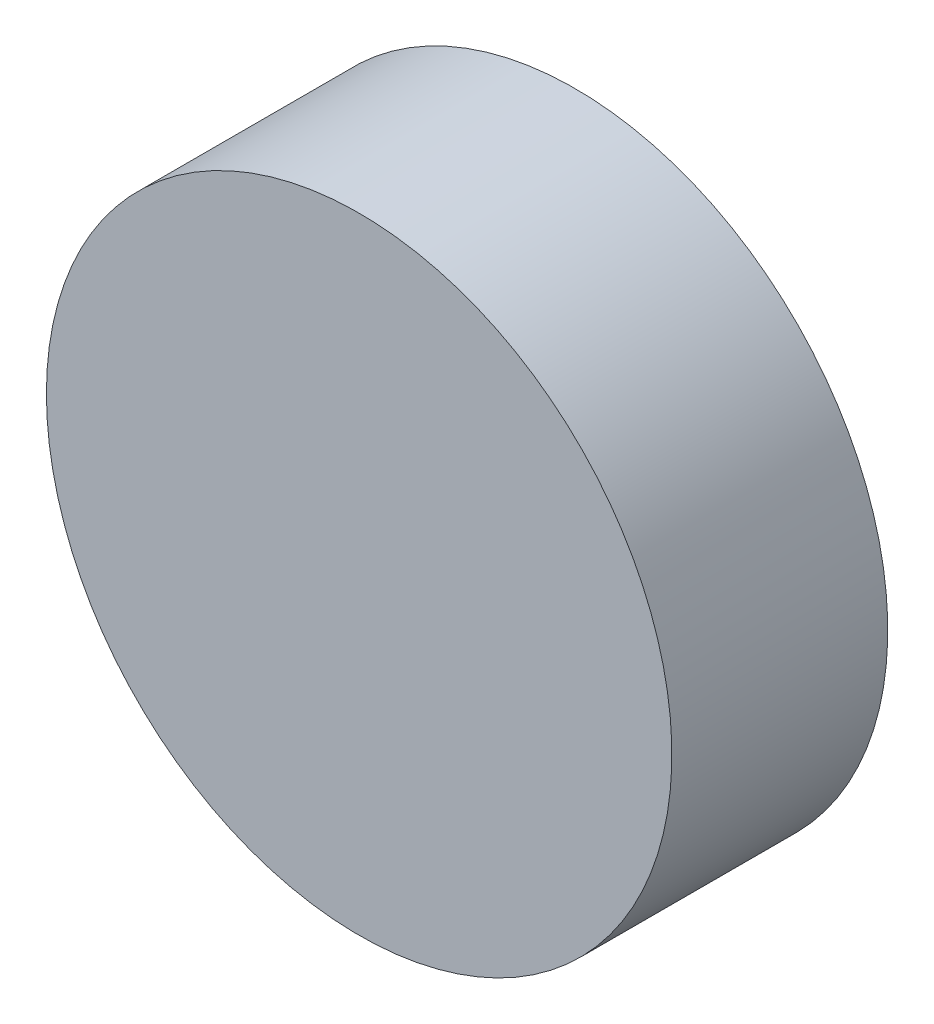
ISO-10303-21;
HEADER;
FILE_DESCRIPTION(('STEP AP214'),'2;1');
FILE_NAME('part.step','',(''),(''),'','','');
FILE_SCHEMA(('AUTOMOTIVE_DESIGN { 1 0 10303 214 1 1 1 1 }'));
ENDSEC;
DATA;
#1=APPLICATION_CONTEXT('core data for automotive mechanical design processes');
#2=APPLICATION_PROTOCOL_DEFINITION('international standard','automotive_design',2000,#1);
#3=PRODUCT_CONTEXT('',#1,'mechanical');
#4=PRODUCT('Part','Part','',(#3));
#5=PRODUCT_RELATED_PRODUCT_CATEGORY('part','',(#4));
#6=PRODUCT_DEFINITION_FORMATION('','',#4);
#7=PRODUCT_DEFINITION_CONTEXT('part definition',#1,'design');
#8=PRODUCT_DEFINITION('design','',#6,#7);
#9=PRODUCT_DEFINITION_SHAPE('','',#8);
#10=(LENGTH_UNIT() NAMED_UNIT(*) SI_UNIT(.MILLI.,.METRE.));
#11=(NAMED_UNIT(*) PLANE_ANGLE_UNIT() SI_UNIT($,.RADIAN.));
#12=(NAMED_UNIT(*) SI_UNIT($,.STERADIAN.) SOLID_ANGLE_UNIT());
#13=UNCERTAINTY_MEASURE_WITH_UNIT(LENGTH_MEASURE(1.E-05),#10,'distance_accuracy_value','');
#14=(GEOMETRIC_REPRESENTATION_CONTEXT(3) GLOBAL_UNCERTAINTY_ASSIGNED_CONTEXT((#13)) GLOBAL_UNIT_ASSIGNED_CONTEXT((#10,
#11,#12)) REPRESENTATION_CONTEXT('',''));
#15=CARTESIAN_POINT('',(0.,0.,0.));
#16=DIRECTION('',(0.,0.,1.));
#17=DIRECTION('',(1.,0.,0.));
#18=AXIS2_PLACEMENT_3D('',#15,#16,#17);
#19=CARTESIAN_POINT('',(3.917,-5.139,7.713));
#20=DIRECTION('',(0.,0.,-1.));
#21=DIRECTION('',(-1.,0.,0.));
#22=AXIS2_PLACEMENT_3D('',#19,#20,#21);
#23=CYLINDRICAL_SURFACE('',#22,11.173);
#24=CARTESIAN_POINT('',(3.917,-5.139,7.713));
#25=DIRECTION('',(0.,0.,1.));
#26=DIRECTION('',(1.,0.,0.));
#27=AXIS2_PLACEMENT_3D('',#24,#25,#26);
#28=CIRCLE('',#27,11.173);
#29=CARTESIAN_POINT('',(-7.256,-5.139,7.713));
#30=VERTEX_POINT('',#29);
#31=EDGE_CURVE('E10',#30,#30,#28,.T.);
#32=CARTESIAN_POINT('',(3.917,-5.139,0.));
#33=DIRECTION('',(0.,0.,1.));
#34=DIRECTION('',(1.,0.,0.));
#35=AXIS2_PLACEMENT_3D('',#32,#33,#34);
#36=CIRCLE('',#35,11.173);
#37=CARTESIAN_POINT('',(-7.256,-5.139,0.));
#38=VERTEX_POINT('',#37);
#39=EDGE_CURVE('E45',#38,#38,#36,.T.);
#40=CARTESIAN_POINT('',(-7.256,-5.139,7.713));
#41=CARTESIAN_POINT('',(-7.256,-5.139,7.63265625));
#42=CARTESIAN_POINT('',(-7.256,-5.139,7.5523125));
#43=CARTESIAN_POINT('',(-7.256,-5.139,7.391625));
#44=CARTESIAN_POINT('',(-7.256,-5.139,7.31128125));
#45=CARTESIAN_POINT('',(-7.256,-5.139,7.15059375));
#46=CARTESIAN_POINT('',(-7.256,-5.139,7.07025));
#47=CARTESIAN_POINT('',(-7.256,-5.139,6.9095625));
#48=CARTESIAN_POINT('',(-7.256,-5.139,6.82921875));
#49=CARTESIAN_POINT('',(-7.256,-5.139,6.66853125));
#50=CARTESIAN_POINT('',(-7.256,-5.139,6.5881875));
#51=CARTESIAN_POINT('',(-7.256,-5.139,6.4275));
#52=CARTESIAN_POINT('',(-7.256,-5.139,6.34715625));
#53=CARTESIAN_POINT('',(-7.256,-5.139,6.18646875));
#54=CARTESIAN_POINT('',(-7.256,-5.139,6.106125));
#55=CARTESIAN_POINT('',(-7.256,-5.139,5.9454375));
#56=CARTESIAN_POINT('',(-7.256,-5.139,5.86509375));
#57=CARTESIAN_POINT('',(-7.256,-5.139,5.70440625));
#58=CARTESIAN_POINT('',(-7.256,-5.139,5.6240625));
#59=CARTESIAN_POINT('',(-7.256,-5.139,5.463375));
#60=CARTESIAN_POINT('',(-7.256,-5.139,5.38303125));
#61=CARTESIAN_POINT('',(-7.256,-5.139,5.22234375));
#62=CARTESIAN_POINT('',(-7.256,-5.139,5.142));
#63=CARTESIAN_POINT('',(-7.256,-5.139,4.9813125));
#64=CARTESIAN_POINT('',(-7.256,-5.139,4.90096875));
#65=CARTESIAN_POINT('',(-7.256,-5.139,4.74028125));
#66=CARTESIAN_POINT('',(-7.256,-5.139,4.6599375));
#67=CARTESIAN_POINT('',(-7.256,-5.139,4.49925));
#68=CARTESIAN_POINT('',(-7.256,-5.139,4.41890625));
#69=CARTESIAN_POINT('',(-7.256,-5.139,4.25821875));
#70=CARTESIAN_POINT('',(-7.256,-5.139,4.177875));
#71=CARTESIAN_POINT('',(-7.256,-5.139,4.0171875));
#72=CARTESIAN_POINT('',(-7.256,-5.139,3.93684375));
#73=CARTESIAN_POINT('',(-7.256,-5.139,3.77615625));
#74=CARTESIAN_POINT('',(-7.256,-5.139,3.6958125));
#75=CARTESIAN_POINT('',(-7.256,-5.139,3.535125));
#76=CARTESIAN_POINT('',(-7.256,-5.139,3.45478125));
#77=CARTESIAN_POINT('',(-7.256,-5.139,3.29409375));
#78=CARTESIAN_POINT('',(-7.256,-5.139,3.21375));
#79=CARTESIAN_POINT('',(-7.256,-5.139,3.0530625));
#80=CARTESIAN_POINT('',(-7.256,-5.139,2.97271875));
#81=CARTESIAN_POINT('',(-7.256,-5.139,2.81203125));
#82=CARTESIAN_POINT('',(-7.256,-5.139,2.7316875));
#83=CARTESIAN_POINT('',(-7.256,-5.139,2.571));
#84=CARTESIAN_POINT('',(-7.256,-5.139,2.49065625));
#85=CARTESIAN_POINT('',(-7.256,-5.139,2.32996875));
#86=CARTESIAN_POINT('',(-7.256,-5.139,2.249625));
#87=CARTESIAN_POINT('',(-7.256,-5.139,2.0889375));
#88=CARTESIAN_POINT('',(-7.256,-5.139,2.00859375));
#89=CARTESIAN_POINT('',(-7.256,-5.139,1.84790625));
#90=CARTESIAN_POINT('',(-7.256,-5.139,1.7675625));
#91=CARTESIAN_POINT('',(-7.256,-5.139,1.606875));
#92=CARTESIAN_POINT('',(-7.256,-5.139,1.52653125));
#93=CARTESIAN_POINT('',(-7.256,-5.139,1.36584375));
#94=CARTESIAN_POINT('',(-7.256,-5.139,1.2855));
#95=CARTESIAN_POINT('',(-7.256,-5.139,1.1248125));
#96=CARTESIAN_POINT('',(-7.256,-5.139,1.04446875));
#97=CARTESIAN_POINT('',(-7.256,-5.139,0.88378125));
#98=CARTESIAN_POINT('',(-7.256,-5.139,0.8034375));
#99=CARTESIAN_POINT('',(-7.256,-5.139,0.64275));
#100=CARTESIAN_POINT('',(-7.256,-5.139,0.56240625));
#101=CARTESIAN_POINT('',(-7.256,-5.139,0.40171875));
#102=CARTESIAN_POINT('',(-7.256,-5.139,0.321375));
#103=CARTESIAN_POINT('',(-7.256,-5.139,0.1606875));
#104=CARTESIAN_POINT('',(-7.256,-5.139,0.08034375));
#105=CARTESIAN_POINT('',(-7.256,-5.139,0.));
#106=B_SPLINE_CURVE_WITH_KNOTS('',3,(#40,#41,#42,#43,#44,#45,#46,#47,#48,#49,#50,#51,#52,#53,
#54,#55,#56,#57,#58,#59,#60,#61,#62,#63,#64,#65,#66,#67,#68,#69,#70,#71,#72,#73,#74,#75,#76,#77,
#78,#79,#80,#81,#82,#83,#84,#85,#86,#87,#88,#89,#90,#91,#92,#93,#94,#95,#96,#97,#98,#99,#100,
#101,#102,#103,#104,#105),.UNSPECIFIED.,.F.,.F.,(4,2,2,2,2,2,2,2,2,2,2,2,2,2,2,2,2,2,2,2,2,2,2,
2,2,2,2,2,2,2,2,2,4),(0.,0.241031250000001,0.482062500000001,0.723093750000001,
0.964125000000001,1.20515625,1.4461875,1.68721875,1.92825,2.16928125,2.4103125,2.65134375,
2.892375,3.13340625,3.3744375,3.61546875,3.8565,4.09753125,4.3385625,4.57959375,4.820625,
5.06165625,5.3026875,5.54371875,5.78475,6.02578125,6.2668125,6.50784375,6.748875,6.98990625,
7.2309375,7.47196875,7.713),.UNSPECIFIED.);
#107=EDGE_CURVE('BSEAM39',#30,#38,#106,.T.);
#108=ORIENTED_EDGE('',*,*,#31,.F.);
#109=ORIENTED_EDGE('',*,*,#39,.T.);
#110=ORIENTED_EDGE('',*,*,#107,.T.);
#111=ORIENTED_EDGE('',*,*,#107,.F.);
#112=EDGE_LOOP('',(#108,#110,#109,#111));
#113=FACE_BOUND('',#112,.T.);
#114=ADVANCED_FACE('F39',(#113),#23,.T.);
#115=CARTESIAN_POINT('',(3.917,-5.139,7.713));
#116=DIRECTION('',(0.,0.,1.));
#117=DIRECTION('',(1.,0.,0.));
#118=AXIS2_PLACEMENT_3D('',#115,#116,#117);
#119=PLANE('',#118);
#120=ORIENTED_EDGE('',*,*,#31,.T.);
#121=EDGE_LOOP('',(#120));
#122=FACE_BOUND('',#121,.T.);
#123=ADVANCED_FACE('F53',(#122),#119,.T.);
#124=CARTESIAN_POINT('',(3.917,-5.139,0.));
#125=DIRECTION('',(0.,0.,1.));
#126=DIRECTION('',(1.,0.,0.));
#127=AXIS2_PLACEMENT_3D('',#124,#125,#126);
#128=PLANE('',#127);
#129=ORIENTED_EDGE('',*,*,#39,.F.);
#130=EDGE_LOOP('',(#129));
#131=FACE_BOUND('',#130,.T.);
#132=ADVANCED_FACE('F55',(#131),#128,.F.);
#133=CLOSED_SHELL('',(#114,#123,#132));
#134=MANIFOLD_SOLID_BREP('B2',#133);
#135=ADVANCED_BREP_SHAPE_REPRESENTATION('',(#18,#134),#14);
#136=SHAPE_DEFINITION_REPRESENTATION(#9,#135);
ENDSEC;
END-ISO-10303-21;
